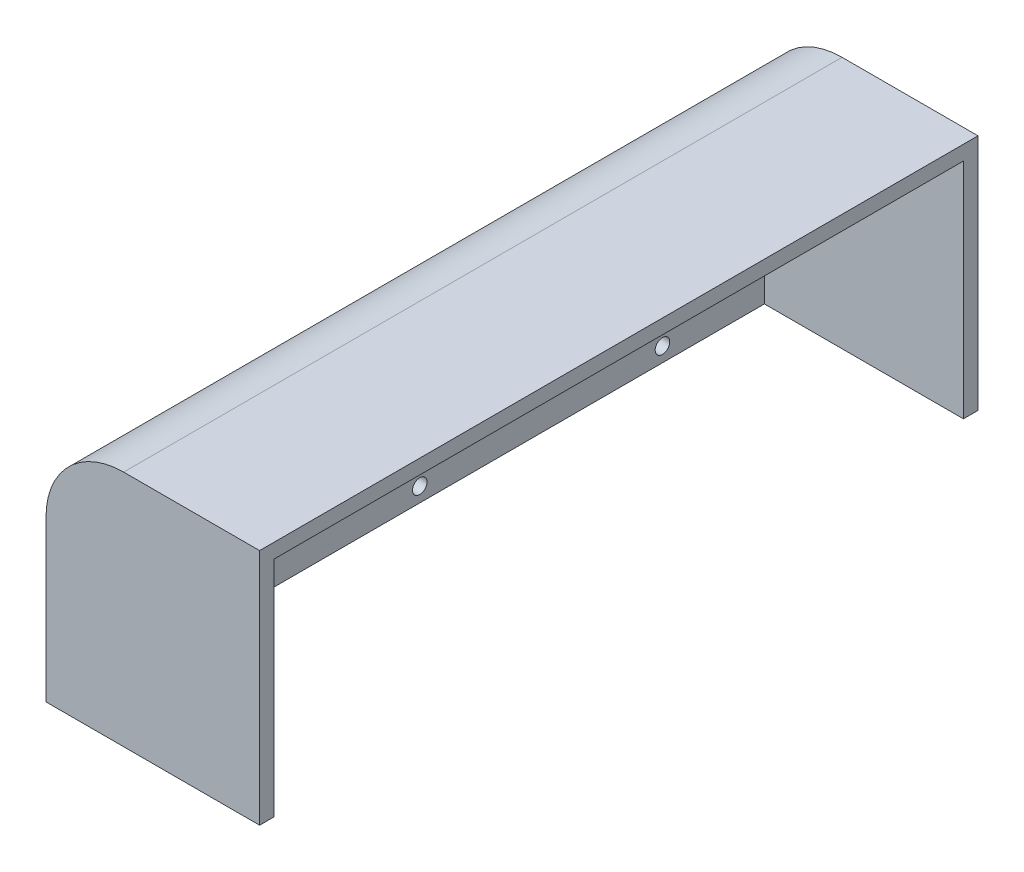
ISO-10303-21;
HEADER;
FILE_DESCRIPTION(('STEP AP214'),'2;1');
FILE_NAME('part.step','',(''),(''),'','','');
FILE_SCHEMA(('AUTOMOTIVE_DESIGN { 1 0 10303 214 1 1 1 1 }'));
ENDSEC;
DATA;
#1=APPLICATION_CONTEXT('core data for automotive mechanical design processes');
#2=APPLICATION_PROTOCOL_DEFINITION('international standard','automotive_design',2000,#1);
#3=PRODUCT_CONTEXT('',#1,'mechanical');
#4=PRODUCT('Part','Part','',(#3));
#5=PRODUCT_RELATED_PRODUCT_CATEGORY('part','',(#4));
#6=PRODUCT_DEFINITION_FORMATION('','',#4);
#7=PRODUCT_DEFINITION_CONTEXT('part definition',#1,'design');
#8=PRODUCT_DEFINITION('design','',#6,#7);
#9=PRODUCT_DEFINITION_SHAPE('','',#8);
#10=(LENGTH_UNIT() NAMED_UNIT(*) SI_UNIT(.MILLI.,.METRE.));
#11=(NAMED_UNIT(*) PLANE_ANGLE_UNIT() SI_UNIT($,.RADIAN.));
#12=(NAMED_UNIT(*) SI_UNIT($,.STERADIAN.) SOLID_ANGLE_UNIT());
#13=UNCERTAINTY_MEASURE_WITH_UNIT(LENGTH_MEASURE(1.E-05),#10,'distance_accuracy_value','');
#14=(GEOMETRIC_REPRESENTATION_CONTEXT(3) GLOBAL_UNCERTAINTY_ASSIGNED_CONTEXT((#13)) GLOBAL_UNIT_ASSIGNED_CONTEXT((#10,
#11,#12)) REPRESENTATION_CONTEXT('',''));
#15=CARTESIAN_POINT('',(0.,0.,0.));
#16=DIRECTION('',(0.,0.,1.));
#17=DIRECTION('',(1.,0.,0.));
#18=AXIS2_PLACEMENT_3D('',#15,#16,#17);
#19=CARTESIAN_POINT('',(-10.5,23.,-35.5));
#20=DIRECTION('',(-1.,0.,0.));
#21=DIRECTION('',(0.,0.,1.));
#22=AXIS2_PLACEMENT_3D('',#19,#20,#21);
#23=PLANE('',#22);
#24=CARTESIAN_POINT('',(-10.5,1.50000000000001,-25.0000000000001));
#25=DIRECTION('',(-1.,0.,0.));
#26=DIRECTION('',(0.,0.,1.));
#27=AXIS2_PLACEMENT_3D('',#24,#25,#26);
#28=CIRCLE('',#27,0.749999999999998);
#29=CARTESIAN_POINT('',(-10.5,1.50000000000001,-24.2500000000001));
#30=VERTEX_POINT('',#29);
#31=EDGE_CURVE('E141',#30,#30,#28,.T.);
#32=ORIENTED_EDGE('',*,*,#31,.T.);
#33=EDGE_LOOP('',(#32));
#34=FACE_BOUND('',#33,.T.);
#35=CARTESIAN_POINT('',(-10.5,1.50000000000001,0.));
#36=DIRECTION('',(-1.,0.,0.));
#37=DIRECTION('',(0.,0.,1.));
#38=AXIS2_PLACEMENT_3D('',#35,#36,#37);
#39=CIRCLE('',#38,0.750000000000001);
#40=CARTESIAN_POINT('',(-10.5,1.50000000000001,0.749999999999929));
#41=VERTEX_POINT('',#40);
#42=EDGE_CURVE('E195',#41,#41,#39,.T.);
#43=ORIENTED_EDGE('',*,*,#42,.T.);
#44=EDGE_LOOP('',(#43));
#45=FACE_BOUND('',#44,.T.);
#46=CARTESIAN_POINT('',(-10.5,1.50000000000001,24.9999999999999));
#47=DIRECTION('',(-1.,0.,0.));
#48=DIRECTION('',(0.,0.,1.));
#49=AXIS2_PLACEMENT_3D('',#46,#47,#48);
#50=CIRCLE('',#49,0.750000000000002);
#51=CARTESIAN_POINT('',(-10.5,1.50000000000001,25.7499999999999));
#52=VERTEX_POINT('',#51);
#53=EDGE_CURVE('E192',#52,#52,#50,.T.);
#54=ORIENTED_EDGE('',*,*,#53,.T.);
#55=EDGE_LOOP('',(#54));
#56=FACE_BOUND('',#55,.T.);
#57=DIRECTION('',(0.,-1.,0.));
#58=VECTOR('',#57,1.);
#59=CARTESIAN_POINT('',(-10.5,23.,-35.5));
#60=LINE('',#59,#58);
#61=CARTESIAN_POINT('',(-10.5,15.,-35.5));
#62=VERTEX_POINT('',#61);
#63=CARTESIAN_POINT('',(-10.5,0.,-35.5));
#64=VERTEX_POINT('',#63);
#65=EDGE_CURVE('E176',#62,#64,#60,.T.);
#66=ORIENTED_EDGE('',*,*,#65,.F.);
#67=DIRECTION('',(0.,0.,-1.));
#68=VECTOR('',#67,1.);
#69=CARTESIAN_POINT('',(-10.5,15.,35.5));
#70=LINE('',#69,#68);
#71=CARTESIAN_POINT('',(-10.5,15.,35.5));
#72=VERTEX_POINT('',#71);
#73=EDGE_CURVE('E183',#62,#72,#70,.F.);
#74=ORIENTED_EDGE('',*,*,#73,.T.);
#75=DIRECTION('',(0.,-1.,0.));
#76=VECTOR('',#75,1.);
#77=CARTESIAN_POINT('',(-10.5,23.,35.5));
#78=LINE('',#77,#76);
#79=CARTESIAN_POINT('',(-10.5,0.,35.5));
#80=VERTEX_POINT('',#79);
#81=EDGE_CURVE('E148',#72,#80,#78,.T.);
#82=ORIENTED_EDGE('',*,*,#81,.T.);
#83=DIRECTION('',(0.,0.,-1.));
#84=VECTOR('',#83,1.);
#85=CARTESIAN_POINT('',(-10.5,0.,-35.5));
#86=LINE('',#85,#84);
#87=EDGE_CURVE('E135',#80,#64,#86,.T.);
#88=ORIENTED_EDGE('',*,*,#87,.T.);
#89=EDGE_LOOP('',(#66,#74,#82,#88));
#90=FACE_BOUND('',#89,.T.);
#91=ADVANCED_FACE('F32',(#34,#45,#56,#90),#23,.F.);
#92=CARTESIAN_POINT('',(-10.5,23.,-35.5));
#93=DIRECTION('',(0.,0.,-1.));
#94=DIRECTION('',(-1.,0.,0.));
#95=AXIS2_PLACEMENT_3D('',#92,#93,#94);
#96=PLANE('',#95);
#97=DIRECTION('',(1.,0.,0.));
#98=VECTOR('',#97,1.);
#99=CARTESIAN_POINT('',(-10.5,23.,-35.5));
#100=LINE('',#99,#98);
#101=CARTESIAN_POINT('',(-2.50000000000001,23.,-35.5));
#102=VERTEX_POINT('',#101);
#103=CARTESIAN_POINT('',(9.99999999999999,23.,-35.5));
#104=VERTEX_POINT('',#103);
#105=EDGE_CURVE('E142',#102,#104,#100,.T.);
#106=ORIENTED_EDGE('',*,*,#105,.F.);
#107=CARTESIAN_POINT('',(-2.50000000000001,15.,-35.5));
#108=DIRECTION('',(0.,0.,-1.));
#109=DIRECTION('',(-1.,0.,0.));
#110=AXIS2_PLACEMENT_3D('',#107,#108,#109);
#111=CIRCLE('',#110,8.);
#112=EDGE_CURVE('E181',#102,#62,#111,.F.);
#113=ORIENTED_EDGE('',*,*,#112,.T.);
#114=ORIENTED_EDGE('',*,*,#65,.T.);
#115=DIRECTION('',(1.,0.,0.));
#116=VECTOR('',#115,1.);
#117=CARTESIAN_POINT('',(-10.5,0.,-35.5));
#118=LINE('',#117,#116);
#119=CARTESIAN_POINT('',(9.99999999999999,0.,-35.5));
#120=VERTEX_POINT('',#119);
#121=EDGE_CURVE('E151',#64,#120,#118,.T.);
#122=ORIENTED_EDGE('',*,*,#121,.T.);
#123=DIRECTION('',(0.,-1.,0.));
#124=VECTOR('',#123,1.);
#125=CARTESIAN_POINT('',(9.99999999999999,23.,-35.5));
#126=LINE('',#125,#124);
#127=EDGE_CURVE('E173',#104,#120,#126,.T.);
#128=ORIENTED_EDGE('',*,*,#127,.F.);
#129=EDGE_LOOP('',(#106,#113,#114,#122,#128));
#130=FACE_BOUND('',#129,.T.);
#131=ADVANCED_FACE('F224',(#130),#96,.F.);
#132=CARTESIAN_POINT('',(-12.,23.,-37.));
#133=DIRECTION('',(0.,0.,1.));
#134=DIRECTION('',(1.,0.,0.));
#135=AXIS2_PLACEMENT_3D('',#132,#133,#134);
#136=PLANE('',#135);
#137=DIRECTION('',(0.,-1.,0.));
#138=VECTOR('',#137,1.);
#139=CARTESIAN_POINT('',(-12.,23.,-37.));
#140=LINE('',#139,#138);
#141=CARTESIAN_POINT('',(-12.,16.5,-37.));
#142=VERTEX_POINT('',#141);
#143=CARTESIAN_POINT('',(-12.,0.,-37.));
#144=VERTEX_POINT('',#143);
#145=EDGE_CURVE('E170',#142,#144,#140,.T.);
#146=ORIENTED_EDGE('',*,*,#145,.F.);
#147=CARTESIAN_POINT('',(-4.00000000000001,16.5,-37.));
#148=DIRECTION('',(0.,0.,1.));
#149=DIRECTION('',(1.,0.,0.));
#150=AXIS2_PLACEMENT_3D('',#147,#148,#149);
#151=CIRCLE('',#150,8.);
#152=CARTESIAN_POINT('',(-4.00000000000001,24.5,-37.));
#153=VERTEX_POINT('',#152);
#154=EDGE_CURVE('E11',#142,#153,#151,.F.);
#155=ORIENTED_EDGE('',*,*,#154,.T.);
#156=DIRECTION('',(-1.,0.,0.));
#157=VECTOR('',#156,1.);
#158=CARTESIAN_POINT('',(-12.,24.5,-37.));
#159=LINE('',#158,#157);
#160=CARTESIAN_POINT('',(10.,24.5,-37.));
#161=VERTEX_POINT('',#160);
#162=EDGE_CURVE('E133',#161,#153,#159,.T.);
#163=ORIENTED_EDGE('',*,*,#162,.F.);
#164=DIRECTION('',(0.,-1.,0.));
#165=VECTOR('',#164,1.);
#166=CARTESIAN_POINT('',(9.99999999999999,23.,-37.));
#167=LINE('',#166,#165);
#168=CARTESIAN_POINT('',(9.99999999999999,0.,-37.));
#169=VERTEX_POINT('',#168);
#170=EDGE_CURVE('E132',#161,#169,#167,.T.);
#171=ORIENTED_EDGE('',*,*,#170,.T.);
#172=DIRECTION('',(-1.,0.,0.));
#173=VECTOR('',#172,1.);
#174=CARTESIAN_POINT('',(-12.,0.,-37.));
#175=LINE('',#174,#173);
#176=EDGE_CURVE('E155',#169,#144,#175,.T.);
#177=ORIENTED_EDGE('',*,*,#176,.T.);
#178=EDGE_LOOP('',(#146,#155,#163,#171,#177));
#179=FACE_BOUND('',#178,.T.);
#180=ADVANCED_FACE('F229',(#179),#136,.F.);
#181=CARTESIAN_POINT('',(-12.,23.,-37.));
#182=DIRECTION('',(1.,0.,0.));
#183=DIRECTION('',(0.,0.,-1.));
#184=AXIS2_PLACEMENT_3D('',#181,#182,#183);
#185=PLANE('',#184);
#186=CARTESIAN_POINT('',(-12.,1.50000000000001,-25.0000000000001));
#187=DIRECTION('',(1.,0.,0.));
#188=DIRECTION('',(0.,0.,-1.));
#189=AXIS2_PLACEMENT_3D('',#186,#187,#188);
#190=CIRCLE('',#189,0.749999999999998);
#191=CARTESIAN_POINT('',(-12.,1.50000000000001,-25.7500000000001));
#192=VERTEX_POINT('',#191);
#193=EDGE_CURVE('E36',#192,#192,#190,.T.);
#194=ORIENTED_EDGE('',*,*,#193,.T.);
#195=EDGE_LOOP('',(#194));
#196=FACE_BOUND('',#195,.T.);
#197=CARTESIAN_POINT('',(-12.,1.50000000000001,0.));
#198=DIRECTION('',(1.,0.,0.));
#199=DIRECTION('',(0.,0.,-1.));
#200=AXIS2_PLACEMENT_3D('',#197,#198,#199);
#201=CIRCLE('',#200,0.750000000000001);
#202=CARTESIAN_POINT('',(-12.,1.50000000000001,-0.750000000000072));
#203=VERTEX_POINT('',#202);
#204=EDGE_CURVE('E193',#203,#203,#201,.T.);
#205=ORIENTED_EDGE('',*,*,#204,.T.);
#206=EDGE_LOOP('',(#205));
#207=FACE_BOUND('',#206,.T.);
#208=CARTESIAN_POINT('',(-12.,1.50000000000001,24.9999999999999));
#209=DIRECTION('',(1.,0.,0.));
#210=DIRECTION('',(0.,0.,-1.));
#211=AXIS2_PLACEMENT_3D('',#208,#209,#210);
#212=CIRCLE('',#211,0.750000000000002);
#213=CARTESIAN_POINT('',(-12.,1.50000000000001,24.2499999999999));
#214=VERTEX_POINT('',#213);
#215=EDGE_CURVE('E190',#214,#214,#212,.T.);
#216=ORIENTED_EDGE('',*,*,#215,.T.);
#217=EDGE_LOOP('',(#216));
#218=FACE_BOUND('',#217,.T.);
#219=DIRECTION('',(0.,-1.,0.));
#220=VECTOR('',#219,1.);
#221=CARTESIAN_POINT('',(-12.,23.,37.));
#222=LINE('',#221,#220);
#223=CARTESIAN_POINT('',(-12.,16.5,37.));
#224=VERTEX_POINT('',#223);
#225=CARTESIAN_POINT('',(-12.,0.,37.));
#226=VERTEX_POINT('',#225);
#227=EDGE_CURVE('E127',#224,#226,#222,.T.);
#228=ORIENTED_EDGE('',*,*,#227,.F.);
#229=DIRECTION('',(0.,0.,1.));
#230=VECTOR('',#229,1.);
#231=CARTESIAN_POINT('',(-12.,16.5,-37.));
#232=LINE('',#231,#230);
#233=EDGE_CURVE('E41',#224,#142,#232,.F.);
#234=ORIENTED_EDGE('',*,*,#233,.T.);
#235=ORIENTED_EDGE('',*,*,#145,.T.);
#236=DIRECTION('',(0.,0.,1.));
#237=VECTOR('',#236,1.);
#238=CARTESIAN_POINT('',(-12.,0.,-37.));
#239=LINE('',#238,#237);
#240=EDGE_CURVE('E158',#144,#226,#239,.T.);
#241=ORIENTED_EDGE('',*,*,#240,.T.);
#242=EDGE_LOOP('',(#228,#234,#235,#241));
#243=FACE_BOUND('',#242,.T.);
#244=ADVANCED_FACE('F210',(#196,#207,#218,#243),#185,.F.);
#245=CARTESIAN_POINT('',(-12.,23.,37.));
#246=DIRECTION('',(0.,0.,-1.));
#247=DIRECTION('',(-1.,0.,0.));
#248=AXIS2_PLACEMENT_3D('',#245,#246,#247);
#249=PLANE('',#248);
#250=DIRECTION('',(1.,0.,0.));
#251=VECTOR('',#250,1.);
#252=CARTESIAN_POINT('',(-12.,24.5,37.));
#253=LINE('',#252,#251);
#254=CARTESIAN_POINT('',(-4.,24.5,37.));
#255=VERTEX_POINT('',#254);
#256=CARTESIAN_POINT('',(10.,24.5,37.));
#257=VERTEX_POINT('',#256);
#258=EDGE_CURVE('E109',#255,#257,#253,.T.);
#259=ORIENTED_EDGE('',*,*,#258,.F.);
#260=CARTESIAN_POINT('',(-4.,16.5,37.));
#261=DIRECTION('',(0.,0.,-1.));
#262=DIRECTION('',(-1.,0.,0.));
#263=AXIS2_PLACEMENT_3D('',#260,#261,#262);
#264=CIRCLE('',#263,8.);
#265=EDGE_CURVE('E56',#255,#224,#264,.F.);
#266=ORIENTED_EDGE('',*,*,#265,.T.);
#267=ORIENTED_EDGE('',*,*,#227,.T.);
#268=DIRECTION('',(1.,0.,0.));
#269=VECTOR('',#268,1.);
#270=CARTESIAN_POINT('',(-12.,0.,37.));
#271=LINE('',#270,#269);
#272=CARTESIAN_POINT('',(10.,0.,37.));
#273=VERTEX_POINT('',#272);
#274=EDGE_CURVE('E124',#226,#273,#271,.T.);
#275=ORIENTED_EDGE('',*,*,#274,.T.);
#276=DIRECTION('',(0.,-1.,0.));
#277=VECTOR('',#276,1.);
#278=CARTESIAN_POINT('',(10.,23.,37.));
#279=LINE('',#278,#277);
#280=EDGE_CURVE('E121',#257,#273,#279,.T.);
#281=ORIENTED_EDGE('',*,*,#280,.F.);
#282=EDGE_LOOP('',(#259,#266,#267,#275,#281));
#283=FACE_BOUND('',#282,.T.);
#284=ADVANCED_FACE('F122',(#283),#249,.F.);
#285=CARTESIAN_POINT('',(10.,23.,35.5));
#286=DIRECTION('',(-1.,0.,0.));
#287=DIRECTION('',(0.,0.,1.));
#288=AXIS2_PLACEMENT_3D('',#285,#286,#287);
#289=PLANE('',#288);
#290=DIRECTION('',(0.,0.,-1.));
#291=VECTOR('',#290,1.);
#292=CARTESIAN_POINT('',(10.,0.,35.5));
#293=LINE('',#292,#291);
#294=CARTESIAN_POINT('',(10.,0.,35.5));
#295=VERTEX_POINT('',#294);
#296=EDGE_CURVE('E162',#273,#295,#293,.T.);
#297=ORIENTED_EDGE('',*,*,#296,.T.);
#298=DIRECTION('',(0.,-1.,0.));
#299=VECTOR('',#298,1.);
#300=CARTESIAN_POINT('',(10.,23.,35.5));
#301=LINE('',#300,#299);
#302=CARTESIAN_POINT('',(10.,23.,35.5));
#303=VERTEX_POINT('',#302);
#304=EDGE_CURVE('E128',#303,#295,#301,.T.);
#305=ORIENTED_EDGE('',*,*,#304,.F.);
#306=DIRECTION('',(0.,0.,-1.));
#307=VECTOR('',#306,1.);
#308=CARTESIAN_POINT('',(10.,23.,-37.));
#309=LINE('',#308,#307);
#310=EDGE_CURVE('E118',#303,#104,#309,.T.);
#311=ORIENTED_EDGE('',*,*,#310,.T.);
#312=ORIENTED_EDGE('',*,*,#127,.T.);
#313=DIRECTION('',(0.,0.,-1.));
#314=VECTOR('',#313,1.);
#315=CARTESIAN_POINT('',(9.99999999999999,0.,-37.));
#316=LINE('',#315,#314);
#317=EDGE_CURVE('E153',#120,#169,#316,.T.);
#318=ORIENTED_EDGE('',*,*,#317,.T.);
#319=ORIENTED_EDGE('',*,*,#170,.F.);
#320=DIRECTION('',(0.,0.,-1.));
#321=VECTOR('',#320,1.);
#322=CARTESIAN_POINT('',(10.,24.5,-37.));
#323=LINE('',#322,#321);
#324=EDGE_CURVE('E114',#257,#161,#323,.T.);
#325=ORIENTED_EDGE('',*,*,#324,.F.);
#326=ORIENTED_EDGE('',*,*,#280,.T.);
#327=EDGE_LOOP('',(#297,#305,#311,#312,#318,#319,#325,#326));
#328=FACE_BOUND('',#327,.T.);
#329=ADVANCED_FACE('F130',(#328),#289,.F.);
#330=CARTESIAN_POINT('',(-10.5,23.,35.5));
#331=DIRECTION('',(0.,0.,1.));
#332=DIRECTION('',(1.,0.,0.));
#333=AXIS2_PLACEMENT_3D('',#330,#331,#332);
#334=PLANE('',#333);
#335=ORIENTED_EDGE('',*,*,#81,.F.);
#336=CARTESIAN_POINT('',(-2.50000000000001,15.,35.5));
#337=DIRECTION('',(0.,0.,1.));
#338=DIRECTION('',(1.,0.,0.));
#339=AXIS2_PLACEMENT_3D('',#336,#337,#338);
#340=CIRCLE('',#339,8.);
#341=CARTESIAN_POINT('',(-2.50000000000001,23.,35.5));
#342=VERTEX_POINT('',#341);
#343=EDGE_CURVE('E185',#72,#342,#340,.F.);
#344=ORIENTED_EDGE('',*,*,#343,.T.);
#345=DIRECTION('',(-1.,0.,0.));
#346=VECTOR('',#345,1.);
#347=CARTESIAN_POINT('',(-10.5,23.,35.5));
#348=LINE('',#347,#346);
#349=EDGE_CURVE('E144',#303,#342,#348,.T.);
#350=ORIENTED_EDGE('',*,*,#349,.F.);
#351=ORIENTED_EDGE('',*,*,#304,.T.);
#352=DIRECTION('',(-1.,0.,0.));
#353=VECTOR('',#352,1.);
#354=CARTESIAN_POINT('',(-10.5,0.,35.5));
#355=LINE('',#354,#353);
#356=EDGE_CURVE('E145',#295,#80,#355,.T.);
#357=ORIENTED_EDGE('',*,*,#356,.T.);
#358=EDGE_LOOP('',(#335,#344,#350,#351,#357));
#359=FACE_BOUND('',#358,.T.);
#360=ADVANCED_FACE('F250',(#359),#334,.F.);
#361=CARTESIAN_POINT('',(0.,0.,0.));
#362=DIRECTION('',(0.,1.,0.));
#363=DIRECTION('',(0.,0.,1.));
#364=AXIS2_PLACEMENT_3D('',#361,#362,#363);
#365=PLANE('',#364);
#366=ORIENTED_EDGE('',*,*,#87,.F.);
#367=ORIENTED_EDGE('',*,*,#356,.F.);
#368=ORIENTED_EDGE('',*,*,#296,.F.);
#369=ORIENTED_EDGE('',*,*,#274,.F.);
#370=ORIENTED_EDGE('',*,*,#240,.F.);
#371=ORIENTED_EDGE('',*,*,#176,.F.);
#372=ORIENTED_EDGE('',*,*,#317,.F.);
#373=ORIENTED_EDGE('',*,*,#121,.F.);
#374=EDGE_LOOP('',(#366,#367,#368,#369,#370,#371,#372,#373));
#375=FACE_BOUND('',#374,.T.);
#376=ADVANCED_FACE('F259',(#375),#365,.F.);
#377=CARTESIAN_POINT('',(0.,23.,0.));
#378=DIRECTION('',(0.,1.,0.));
#379=DIRECTION('',(0.,0.,1.));
#380=AXIS2_PLACEMENT_3D('',#377,#378,#379);
#381=PLANE('',#380);
#382=ORIENTED_EDGE('',*,*,#349,.T.);
#383=DIRECTION('',(0.,0.,-1.));
#384=VECTOR('',#383,1.);
#385=CARTESIAN_POINT('',(-2.50000000000001,23.,-35.5));
#386=LINE('',#385,#384);
#387=EDGE_CURVE('E178',#342,#102,#386,.T.);
#388=ORIENTED_EDGE('',*,*,#387,.T.);
#389=ORIENTED_EDGE('',*,*,#105,.T.);
#390=ORIENTED_EDGE('',*,*,#310,.F.);
#391=EDGE_LOOP('',(#382,#388,#389,#390));
#392=FACE_BOUND('',#391,.T.);
#393=ADVANCED_FACE('F242',(#392),#381,.F.);
#394=CARTESIAN_POINT('',(0.,24.5,0.));
#395=DIRECTION('',(0.,1.,0.));
#396=DIRECTION('',(0.,0.,1.));
#397=AXIS2_PLACEMENT_3D('',#394,#395,#396);
#398=PLANE('',#397);
#399=ORIENTED_EDGE('',*,*,#162,.T.);
#400=DIRECTION('',(0.,0.,1.));
#401=VECTOR('',#400,1.);
#402=CARTESIAN_POINT('',(-4.,24.5,37.));
#403=LINE('',#402,#401);
#404=EDGE_CURVE('E117',#153,#255,#403,.T.);
#405=ORIENTED_EDGE('',*,*,#404,.T.);
#406=ORIENTED_EDGE('',*,*,#258,.T.);
#407=ORIENTED_EDGE('',*,*,#324,.T.);
#408=EDGE_LOOP('',(#399,#405,#406,#407));
#409=FACE_BOUND('',#408,.T.);
#410=ADVANCED_FACE('F112',(#409),#398,.T.);
#411=CARTESIAN_POINT('',(-2.50000000000001,15.,0.));
#412=DIRECTION('',(0.,0.,1.));
#413=DIRECTION('',(1.,0.,0.));
#414=AXIS2_PLACEMENT_3D('',#411,#412,#413);
#415=CYLINDRICAL_SURFACE('',#414,8.);
#416=ORIENTED_EDGE('',*,*,#343,.F.);
#417=ORIENTED_EDGE('',*,*,#73,.F.);
#418=ORIENTED_EDGE('',*,*,#112,.F.);
#419=ORIENTED_EDGE('',*,*,#387,.F.);
#420=EDGE_LOOP('',(#416,#417,#418,#419));
#421=FACE_BOUND('',#420,.T.);
#422=ADVANCED_FACE('F234',(#421),#415,.F.);
#423=CARTESIAN_POINT('',(-4.,16.5,0.));
#424=DIRECTION('',(0.,0.,-1.));
#425=DIRECTION('',(-1.,0.,0.));
#426=AXIS2_PLACEMENT_3D('',#423,#424,#425);
#427=CYLINDRICAL_SURFACE('',#426,8.);
#428=ORIENTED_EDGE('',*,*,#154,.F.);
#429=ORIENTED_EDGE('',*,*,#233,.F.);
#430=ORIENTED_EDGE('',*,*,#265,.F.);
#431=ORIENTED_EDGE('',*,*,#404,.F.);
#432=EDGE_LOOP('',(#428,#429,#430,#431));
#433=FACE_BOUND('',#432,.T.);
#434=ADVANCED_FACE('F34',(#433),#427,.T.);
#435=CARTESIAN_POINT('',(10.,1.50000000000001,24.9999999999999));
#436=DIRECTION('',(-1.,0.,0.));
#437=DIRECTION('',(0.,0.,1.));
#438=AXIS2_PLACEMENT_3D('',#435,#436,#437);
#439=CYLINDRICAL_SURFACE('',#438,0.750000000000002);
#440=ORIENTED_EDGE('',*,*,#215,.F.);
#441=EDGE_LOOP('',(#440));
#442=FACE_BOUND('',#441,.T.);
#443=ORIENTED_EDGE('',*,*,#53,.F.);
#444=EDGE_LOOP('',(#443));
#445=FACE_BOUND('',#444,.T.);
#446=ADVANCED_FACE('F220',(#442,#445),#439,.F.);
#447=CARTESIAN_POINT('',(10.,1.50000000000001,0.));
#448=DIRECTION('',(-1.,0.,0.));
#449=DIRECTION('',(0.,0.,1.));
#450=AXIS2_PLACEMENT_3D('',#447,#448,#449);
#451=CYLINDRICAL_SURFACE('',#450,0.750000000000001);
#452=ORIENTED_EDGE('',*,*,#204,.F.);
#453=EDGE_LOOP('',(#452));
#454=FACE_BOUND('',#453,.T.);
#455=ORIENTED_EDGE('',*,*,#42,.F.);
#456=EDGE_LOOP('',(#455));
#457=FACE_BOUND('',#456,.T.);
#458=ADVANCED_FACE('F215',(#454,#457),#451,.F.);
#459=CARTESIAN_POINT('',(10.,1.50000000000001,-25.0000000000001));
#460=DIRECTION('',(-1.,0.,0.));
#461=DIRECTION('',(0.,0.,1.));
#462=AXIS2_PLACEMENT_3D('',#459,#460,#461);
#463=CYLINDRICAL_SURFACE('',#462,0.749999999999998);
#464=ORIENTED_EDGE('',*,*,#193,.F.);
#465=EDGE_LOOP('',(#464));
#466=FACE_BOUND('',#465,.T.);
#467=ORIENTED_EDGE('',*,*,#31,.F.);
#468=EDGE_LOOP('',(#467));
#469=FACE_BOUND('',#468,.T.);
#470=ADVANCED_FACE('F212',(#466,#469),#463,.F.);
#471=CLOSED_SHELL('',(#91,#131,#180,#244,#284,#329,#360,#376,#393,#410,#422,#434,#446,#458,#470));
#472=MANIFOLD_SOLID_BREP('B2',#471);
#473=ADVANCED_BREP_SHAPE_REPRESENTATION('',(#18,#472),#14);
#474=SHAPE_DEFINITION_REPRESENTATION(#9,#473);
ENDSEC;
END-ISO-10303-21;
